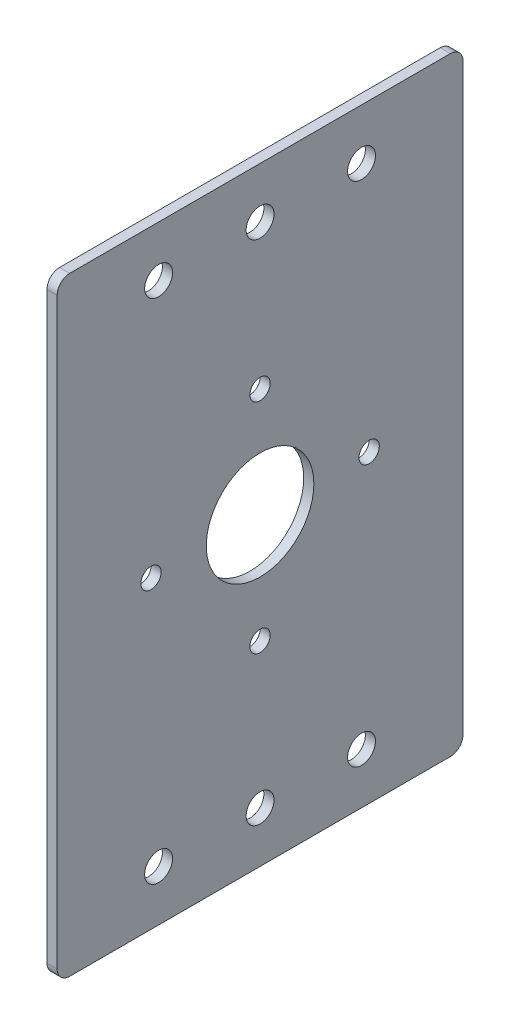
ISO-10303-21;
HEADER;
FILE_DESCRIPTION(('STEP AP214'),'2;1');
FILE_NAME('part.step','',(''),(''),'','','');
FILE_SCHEMA(('AUTOMOTIVE_DESIGN { 1 0 10303 214 1 1 1 1 }'));
ENDSEC;
DATA;
#1=APPLICATION_CONTEXT('core data for automotive mechanical design processes');
#2=APPLICATION_PROTOCOL_DEFINITION('international standard','automotive_design',2000,#1);
#3=PRODUCT_CONTEXT('',#1,'mechanical');
#4=PRODUCT('Part','Part','',(#3));
#5=PRODUCT_RELATED_PRODUCT_CATEGORY('part','',(#4));
#6=PRODUCT_DEFINITION_FORMATION('','',#4);
#7=PRODUCT_DEFINITION_CONTEXT('part definition',#1,'design');
#8=PRODUCT_DEFINITION('design','',#6,#7);
#9=PRODUCT_DEFINITION_SHAPE('','',#8);
#10=(LENGTH_UNIT() NAMED_UNIT(*) SI_UNIT(.MILLI.,.METRE.));
#11=(NAMED_UNIT(*) PLANE_ANGLE_UNIT() SI_UNIT($,.RADIAN.));
#12=(NAMED_UNIT(*) SI_UNIT($,.STERADIAN.) SOLID_ANGLE_UNIT());
#13=UNCERTAINTY_MEASURE_WITH_UNIT(LENGTH_MEASURE(1.E-05),#10,'distance_accuracy_value','');
#14=(GEOMETRIC_REPRESENTATION_CONTEXT(3) GLOBAL_UNCERTAINTY_ASSIGNED_CONTEXT((#13)) GLOBAL_UNIT_ASSIGNED_CONTEXT((#10,
#11,#12)) REPRESENTATION_CONTEXT('',''));
#15=CARTESIAN_POINT('',(0.,0.,0.));
#16=DIRECTION('',(0.,0.,1.));
#17=DIRECTION('',(1.,0.,0.));
#18=AXIS2_PLACEMENT_3D('',#15,#16,#17);
#19=CARTESIAN_POINT('',(2.54,0.,0.));
#20=DIRECTION('',(-1.,0.,0.));
#21=DIRECTION('',(0.,0.,1.));
#22=AXIS2_PLACEMENT_3D('',#19,#20,#21);
#23=PLANE('',#22);
#24=CARTESIAN_POINT('',(2.54,139.7,-25.4));
#25=DIRECTION('',(1.,0.,0.));
#26=DIRECTION('',(0.,0.,-1.));
#27=AXIS2_PLACEMENT_3D('',#24,#25,#26);
#28=CIRCLE('',#27,3.4925);
#29=CARTESIAN_POINT('',(2.54,139.7,-28.8925));
#30=VERTEX_POINT('',#29);
#31=EDGE_CURVE('E248',#30,#30,#28,.T.);
#32=ORIENTED_EDGE('',*,*,#31,.F.);
#33=EDGE_LOOP('',(#32));
#34=FACE_BOUND('',#33,.T.);
#35=CARTESIAN_POINT('',(2.54,12.7,-25.4));
#36=DIRECTION('',(1.,0.,0.));
#37=DIRECTION('',(0.,0.,-1.));
#38=AXIS2_PLACEMENT_3D('',#35,#36,#37);
#39=CIRCLE('',#38,3.49250000000001);
#40=CARTESIAN_POINT('',(2.54,12.7,-28.8925));
#41=VERTEX_POINT('',#40);
#42=EDGE_CURVE('E242',#41,#41,#39,.T.);
#43=ORIENTED_EDGE('',*,*,#42,.F.);
#44=EDGE_LOOP('',(#43));
#45=FACE_BOUND('',#44,.T.);
#46=CARTESIAN_POINT('',(2.54,139.7,-76.2));
#47=DIRECTION('',(1.,0.,0.));
#48=DIRECTION('',(0.,0.,-1.));
#49=AXIS2_PLACEMENT_3D('',#46,#47,#48);
#50=CIRCLE('',#49,3.4925);
#51=CARTESIAN_POINT('',(2.54,139.7,-79.6925));
#52=VERTEX_POINT('',#51);
#53=EDGE_CURVE('E237',#52,#52,#50,.T.);
#54=ORIENTED_EDGE('',*,*,#53,.F.);
#55=EDGE_LOOP('',(#54));
#56=FACE_BOUND('',#55,.T.);
#57=CARTESIAN_POINT('',(2.54,12.7,-76.2));
#58=DIRECTION('',(1.,0.,0.));
#59=DIRECTION('',(0.,0.,-1.));
#60=AXIS2_PLACEMENT_3D('',#57,#58,#59);
#61=CIRCLE('',#60,3.49250000000001);
#62=CARTESIAN_POINT('',(2.54,12.7,-79.6925));
#63=VERTEX_POINT('',#62);
#64=EDGE_CURVE('E230',#63,#63,#61,.T.);
#65=ORIENTED_EDGE('',*,*,#64,.F.);
#66=EDGE_LOOP('',(#65));
#67=FACE_BOUND('',#66,.T.);
#68=CARTESIAN_POINT('',(2.54,139.7,-50.8));
#69=DIRECTION('',(1.,0.,0.));
#70=DIRECTION('',(0.,0.,-1.));
#71=AXIS2_PLACEMENT_3D('',#68,#69,#70);
#72=CIRCLE('',#71,3.4925);
#73=CARTESIAN_POINT('',(2.54,139.7,-54.2925));
#74=VERTEX_POINT('',#73);
#75=EDGE_CURVE('E225',#74,#74,#72,.T.);
#76=ORIENTED_EDGE('',*,*,#75,.F.);
#77=EDGE_LOOP('',(#76));
#78=FACE_BOUND('',#77,.T.);
#79=CARTESIAN_POINT('',(2.54,12.7,-50.8));
#80=DIRECTION('',(1.,0.,0.));
#81=DIRECTION('',(0.,0.,-1.));
#82=AXIS2_PLACEMENT_3D('',#79,#80,#81);
#83=CIRCLE('',#82,3.49250000000001);
#84=CARTESIAN_POINT('',(2.54,12.7,-54.2925));
#85=VERTEX_POINT('',#84);
#86=EDGE_CURVE('E221',#85,#85,#83,.T.);
#87=ORIENTED_EDGE('',*,*,#86,.F.);
#88=EDGE_LOOP('',(#87));
#89=FACE_BOUND('',#88,.T.);
#90=DIRECTION('',(0.,0.,-1.));
#91=VECTOR('',#90,1.);
#92=CARTESIAN_POINT('',(2.54,0.,0.));
#93=LINE('',#92,#91);
#94=CARTESIAN_POINT('',(2.54,0.,-3.175));
#95=VERTEX_POINT('',#94);
#96=CARTESIAN_POINT('',(2.54,0.,-98.425));
#97=VERTEX_POINT('',#96);
#98=EDGE_CURVE('E177',#95,#97,#93,.T.);
#99=ORIENTED_EDGE('',*,*,#98,.T.);
#100=CARTESIAN_POINT('',(2.54,3.175,-98.425));
#101=DIRECTION('',(-1.,0.,0.));
#102=DIRECTION('',(0.,0.,1.));
#103=AXIS2_PLACEMENT_3D('',#100,#101,#102);
#104=CIRCLE('',#103,3.175);
#105=CARTESIAN_POINT('',(2.54,3.175,-101.6));
#106=VERTEX_POINT('',#105);
#107=EDGE_CURVE('E157',#97,#106,#104,.F.);
#108=ORIENTED_EDGE('',*,*,#107,.T.);
#109=DIRECTION('',(0.,1.,0.));
#110=VECTOR('',#109,1.);
#111=CARTESIAN_POINT('',(2.54,0.,-101.6));
#112=LINE('',#111,#110);
#113=CARTESIAN_POINT('',(2.54,149.225,-101.6));
#114=VERTEX_POINT('',#113);
#115=EDGE_CURVE('E127',#106,#114,#112,.T.);
#116=ORIENTED_EDGE('',*,*,#115,.T.);
#117=CARTESIAN_POINT('',(2.54,149.225,-98.425));
#118=DIRECTION('',(-1.,0.,0.));
#119=DIRECTION('',(0.,0.,1.));
#120=AXIS2_PLACEMENT_3D('',#117,#118,#119);
#121=CIRCLE('',#120,3.175);
#122=CARTESIAN_POINT('',(2.54,152.4,-98.425));
#123=VERTEX_POINT('',#122);
#124=EDGE_CURVE('E63',#114,#123,#121,.F.);
#125=ORIENTED_EDGE('',*,*,#124,.T.);
#126=DIRECTION('',(0.,0.,1.));
#127=VECTOR('',#126,1.);
#128=CARTESIAN_POINT('',(2.54,152.4,0.));
#129=LINE('',#128,#127);
#130=CARTESIAN_POINT('',(2.54,152.4,-3.175));
#131=VERTEX_POINT('',#130);
#132=EDGE_CURVE('E144',#123,#131,#129,.T.);
#133=ORIENTED_EDGE('',*,*,#132,.T.);
#134=CARTESIAN_POINT('',(2.54,149.225,-3.175));
#135=DIRECTION('',(-1.,0.,0.));
#136=DIRECTION('',(0.,0.,1.));
#137=AXIS2_PLACEMENT_3D('',#134,#135,#136);
#138=CIRCLE('',#137,3.175);
#139=CARTESIAN_POINT('',(2.54,149.225,0.));
#140=VERTEX_POINT('',#139);
#141=EDGE_CURVE('E152',#131,#140,#138,.F.);
#142=ORIENTED_EDGE('',*,*,#141,.T.);
#143=DIRECTION('',(0.,-1.,0.));
#144=VECTOR('',#143,1.);
#145=CARTESIAN_POINT('',(2.54,0.,0.));
#146=LINE('',#145,#144);
#147=CARTESIAN_POINT('',(2.54,3.175,0.));
#148=VERTEX_POINT('',#147);
#149=EDGE_CURVE('E138',#140,#148,#146,.T.);
#150=ORIENTED_EDGE('',*,*,#149,.T.);
#151=CARTESIAN_POINT('',(2.54,3.175,-3.175));
#152=DIRECTION('',(-1.,0.,0.));
#153=DIRECTION('',(0.,0.,1.));
#154=AXIS2_PLACEMENT_3D('',#151,#152,#153);
#155=CIRCLE('',#154,3.175);
#156=EDGE_CURVE('E155',#148,#95,#155,.F.);
#157=ORIENTED_EDGE('',*,*,#156,.T.);
#158=EDGE_LOOP('',(#99,#108,#116,#125,#133,#142,#150,#157));
#159=FACE_BOUND('',#158,.T.);
#160=CARTESIAN_POINT('',(2.54,76.2,-78.105));
#161=DIRECTION('',(1.,0.,0.));
#162=DIRECTION('',(0.,0.,-1.));
#163=AXIS2_PLACEMENT_3D('',#160,#161,#162);
#164=CIRCLE('',#163,2.53999999999995);
#165=CARTESIAN_POINT('',(2.54,76.2,-80.645));
#166=VERTEX_POINT('',#165);
#167=EDGE_CURVE('E183',#166,#166,#164,.T.);
#168=ORIENTED_EDGE('',*,*,#167,.F.);
#169=EDGE_LOOP('',(#168));
#170=FACE_BOUND('',#169,.T.);
#171=CARTESIAN_POINT('',(2.54,76.2,-50.8));
#172=DIRECTION('',(1.,0.,0.));
#173=DIRECTION('',(0.,0.,-1.));
#174=AXIS2_PLACEMENT_3D('',#171,#172,#173);
#175=CIRCLE('',#174,13.462);
#176=CARTESIAN_POINT('',(2.54,76.2,-64.262));
#177=VERTEX_POINT('',#176);
#178=EDGE_CURVE('E192',#177,#177,#175,.T.);
#179=ORIENTED_EDGE('',*,*,#178,.F.);
#180=EDGE_LOOP('',(#179));
#181=FACE_BOUND('',#180,.T.);
#182=CARTESIAN_POINT('',(2.54,48.895,-50.8));
#183=DIRECTION('',(1.,0.,0.));
#184=DIRECTION('',(0.,0.,-1.));
#185=AXIS2_PLACEMENT_3D('',#182,#183,#184);
#186=CIRCLE('',#185,2.54000000000003);
#187=CARTESIAN_POINT('',(2.54,48.895,-53.34));
#188=VERTEX_POINT('',#187);
#189=EDGE_CURVE('E197',#188,#188,#186,.T.);
#190=ORIENTED_EDGE('',*,*,#189,.F.);
#191=EDGE_LOOP('',(#190));
#192=FACE_BOUND('',#191,.T.);
#193=CARTESIAN_POINT('',(2.54,76.2,-23.495));
#194=DIRECTION('',(1.,0.,0.));
#195=DIRECTION('',(0.,0.,-1.));
#196=AXIS2_PLACEMENT_3D('',#193,#194,#195);
#197=CIRCLE('',#196,2.53999999999999);
#198=CARTESIAN_POINT('',(2.54,76.2,-26.035));
#199=VERTEX_POINT('',#198);
#200=EDGE_CURVE('E203',#199,#199,#197,.T.);
#201=ORIENTED_EDGE('',*,*,#200,.F.);
#202=EDGE_LOOP('',(#201));
#203=FACE_BOUND('',#202,.T.);
#204=CARTESIAN_POINT('',(2.54,103.505,-50.8));
#205=DIRECTION('',(1.,0.,0.));
#206=DIRECTION('',(0.,0.,-1.));
#207=AXIS2_PLACEMENT_3D('',#204,#205,#206);
#208=CIRCLE('',#207,2.54000000000002);
#209=CARTESIAN_POINT('',(2.54,103.505,-53.3400000000001));
#210=VERTEX_POINT('',#209);
#211=EDGE_CURVE('E209',#210,#210,#208,.T.);
#212=ORIENTED_EDGE('',*,*,#211,.F.);
#213=EDGE_LOOP('',(#212));
#214=FACE_BOUND('',#213,.T.);
#215=ADVANCED_FACE('F42',(#34,#45,#56,#67,#78,#89,#159,#170,#181,#192,#203,#214),#23,.F.);
#216=CARTESIAN_POINT('',(0.,0.,0.));
#217=DIRECTION('',(-1.,0.,0.));
#218=DIRECTION('',(0.,0.,1.));
#219=AXIS2_PLACEMENT_3D('',#216,#217,#218);
#220=PLANE('',#219);
#221=CARTESIAN_POINT('',(0.,139.7,-25.4));
#222=DIRECTION('',(1.,0.,0.));
#223=DIRECTION('',(0.,0.,-1.));
#224=AXIS2_PLACEMENT_3D('',#221,#222,#223);
#225=CIRCLE('',#224,3.4925);
#226=CARTESIAN_POINT('',(0.,139.7,-28.8925));
#227=VERTEX_POINT('',#226);
#228=EDGE_CURVE('E234',#227,#227,#225,.T.);
#229=ORIENTED_EDGE('',*,*,#228,.T.);
#230=EDGE_LOOP('',(#229));
#231=FACE_BOUND('',#230,.T.);
#232=CARTESIAN_POINT('',(0.,12.7,-25.4));
#233=DIRECTION('',(1.,0.,0.));
#234=DIRECTION('',(0.,0.,-1.));
#235=AXIS2_PLACEMENT_3D('',#232,#233,#234);
#236=CIRCLE('',#235,3.49250000000001);
#237=CARTESIAN_POINT('',(0.,12.7,-28.8925));
#238=VERTEX_POINT('',#237);
#239=EDGE_CURVE('E245',#238,#238,#236,.T.);
#240=ORIENTED_EDGE('',*,*,#239,.T.);
#241=EDGE_LOOP('',(#240));
#242=FACE_BOUND('',#241,.T.);
#243=CARTESIAN_POINT('',(0.,139.7,-76.2));
#244=DIRECTION('',(1.,0.,0.));
#245=DIRECTION('',(0.,0.,-1.));
#246=AXIS2_PLACEMENT_3D('',#243,#244,#245);
#247=CIRCLE('',#246,3.4925);
#248=CARTESIAN_POINT('',(0.,139.7,-79.6925));
#249=VERTEX_POINT('',#248);
#250=EDGE_CURVE('E222',#249,#249,#247,.T.);
#251=ORIENTED_EDGE('',*,*,#250,.T.);
#252=EDGE_LOOP('',(#251));
#253=FACE_BOUND('',#252,.T.);
#254=CARTESIAN_POINT('',(0.,12.7,-76.2));
#255=DIRECTION('',(1.,0.,0.));
#256=DIRECTION('',(0.,0.,-1.));
#257=AXIS2_PLACEMENT_3D('',#254,#255,#256);
#258=CIRCLE('',#257,3.49250000000001);
#259=CARTESIAN_POINT('',(0.,12.7,-79.6925));
#260=VERTEX_POINT('',#259);
#261=EDGE_CURVE('E233',#260,#260,#258,.T.);
#262=ORIENTED_EDGE('',*,*,#261,.T.);
#263=EDGE_LOOP('',(#262));
#264=FACE_BOUND('',#263,.T.);
#265=CARTESIAN_POINT('',(0.,139.7,-50.8));
#266=DIRECTION('',(1.,0.,0.));
#267=DIRECTION('',(0.,0.,-1.));
#268=AXIS2_PLACEMENT_3D('',#265,#266,#267);
#269=CIRCLE('',#268,3.4925);
#270=CARTESIAN_POINT('',(0.,139.7,-54.2925));
#271=VERTEX_POINT('',#270);
#272=EDGE_CURVE('E215',#271,#271,#269,.T.);
#273=ORIENTED_EDGE('',*,*,#272,.T.);
#274=EDGE_LOOP('',(#273));
#275=FACE_BOUND('',#274,.T.);
#276=CARTESIAN_POINT('',(0.,12.7,-50.8));
#277=DIRECTION('',(1.,0.,0.));
#278=DIRECTION('',(0.,0.,-1.));
#279=AXIS2_PLACEMENT_3D('',#276,#277,#278);
#280=CIRCLE('',#279,3.49250000000001);
#281=CARTESIAN_POINT('',(0.,12.7,-54.2925));
#282=VERTEX_POINT('',#281);
#283=EDGE_CURVE('E218',#282,#282,#280,.T.);
#284=ORIENTED_EDGE('',*,*,#283,.T.);
#285=EDGE_LOOP('',(#284));
#286=FACE_BOUND('',#285,.T.);
#287=CARTESIAN_POINT('',(0.,76.2,-23.495));
#288=DIRECTION('',(1.,0.,0.));
#289=DIRECTION('',(0.,0.,-1.));
#290=AXIS2_PLACEMENT_3D('',#287,#288,#289);
#291=CIRCLE('',#290,2.53999999999999);
#292=CARTESIAN_POINT('',(0.,76.2,-26.035));
#293=VERTEX_POINT('',#292);
#294=EDGE_CURVE('E206',#293,#293,#291,.T.);
#295=ORIENTED_EDGE('',*,*,#294,.T.);
#296=EDGE_LOOP('',(#295));
#297=FACE_BOUND('',#296,.T.);
#298=CARTESIAN_POINT('',(0.,76.2,-50.8));
#299=DIRECTION('',(1.,0.,0.));
#300=DIRECTION('',(0.,0.,-1.));
#301=AXIS2_PLACEMENT_3D('',#298,#299,#300);
#302=CIRCLE('',#301,13.462);
#303=CARTESIAN_POINT('',(0.,76.2,-64.262));
#304=VERTEX_POINT('',#303);
#305=EDGE_CURVE('E194',#304,#304,#302,.T.);
#306=ORIENTED_EDGE('',*,*,#305,.T.);
#307=EDGE_LOOP('',(#306));
#308=FACE_BOUND('',#307,.T.);
#309=DIRECTION('',(0.,1.,0.));
#310=VECTOR('',#309,1.);
#311=CARTESIAN_POINT('',(0.,0.,-101.6));
#312=LINE('',#311,#310);
#313=CARTESIAN_POINT('',(0.,3.175,-101.6));
#314=VERTEX_POINT('',#313);
#315=CARTESIAN_POINT('',(0.,149.225,-101.6));
#316=VERTEX_POINT('',#315);
#317=EDGE_CURVE('E125',#314,#316,#312,.T.);
#318=ORIENTED_EDGE('',*,*,#317,.F.);
#319=CARTESIAN_POINT('',(0.,3.175,-98.425));
#320=DIRECTION('',(-1.,0.,0.));
#321=DIRECTION('',(0.,0.,1.));
#322=AXIS2_PLACEMENT_3D('',#319,#320,#321);
#323=CIRCLE('',#322,3.175);
#324=CARTESIAN_POINT('',(0.,0.,-98.425));
#325=VERTEX_POINT('',#324);
#326=EDGE_CURVE('E108',#314,#325,#323,.T.);
#327=ORIENTED_EDGE('',*,*,#326,.T.);
#328=DIRECTION('',(0.,0.,-1.));
#329=VECTOR('',#328,1.);
#330=CARTESIAN_POINT('',(0.,0.,0.));
#331=LINE('',#330,#329);
#332=CARTESIAN_POINT('',(0.,0.,-3.175));
#333=VERTEX_POINT('',#332);
#334=EDGE_CURVE('E136',#333,#325,#331,.T.);
#335=ORIENTED_EDGE('',*,*,#334,.F.);
#336=CARTESIAN_POINT('',(0.,3.175,-3.175));
#337=DIRECTION('',(-1.,0.,0.));
#338=DIRECTION('',(0.,0.,1.));
#339=AXIS2_PLACEMENT_3D('',#336,#337,#338);
#340=CIRCLE('',#339,3.175);
#341=CARTESIAN_POINT('',(0.,3.175,0.));
#342=VERTEX_POINT('',#341);
#343=EDGE_CURVE('E119',#333,#342,#340,.T.);
#344=ORIENTED_EDGE('',*,*,#343,.T.);
#345=DIRECTION('',(0.,-1.,0.));
#346=VECTOR('',#345,1.);
#347=CARTESIAN_POINT('',(0.,0.,0.));
#348=LINE('',#347,#346);
#349=CARTESIAN_POINT('',(0.,149.225,0.));
#350=VERTEX_POINT('',#349);
#351=EDGE_CURVE('E140',#350,#342,#348,.T.);
#352=ORIENTED_EDGE('',*,*,#351,.F.);
#353=CARTESIAN_POINT('',(0.,149.225,-3.175));
#354=DIRECTION('',(-1.,0.,0.));
#355=DIRECTION('',(0.,0.,1.));
#356=AXIS2_PLACEMENT_3D('',#353,#354,#355);
#357=CIRCLE('',#356,3.175);
#358=CARTESIAN_POINT('',(0.,152.4,-3.175));
#359=VERTEX_POINT('',#358);
#360=EDGE_CURVE('E128',#350,#359,#357,.T.);
#361=ORIENTED_EDGE('',*,*,#360,.T.);
#362=DIRECTION('',(0.,0.,1.));
#363=VECTOR('',#362,1.);
#364=CARTESIAN_POINT('',(0.,152.4,0.));
#365=LINE('',#364,#363);
#366=CARTESIAN_POINT('',(0.,152.4,-98.425));
#367=VERTEX_POINT('',#366);
#368=EDGE_CURVE('E135',#367,#359,#365,.T.);
#369=ORIENTED_EDGE('',*,*,#368,.F.);
#370=CARTESIAN_POINT('',(0.,149.225,-98.425));
#371=DIRECTION('',(-1.,0.,0.));
#372=DIRECTION('',(0.,0.,1.));
#373=AXIS2_PLACEMENT_3D('',#370,#371,#372);
#374=CIRCLE('',#373,3.175);
#375=EDGE_CURVE('E134',#367,#316,#374,.T.);
#376=ORIENTED_EDGE('',*,*,#375,.T.);
#377=EDGE_LOOP('',(#318,#327,#335,#344,#352,#361,#369,#376));
#378=FACE_BOUND('',#377,.T.);
#379=CARTESIAN_POINT('',(0.,76.2,-78.105));
#380=DIRECTION('',(1.,0.,0.));
#381=DIRECTION('',(0.,0.,-1.));
#382=AXIS2_PLACEMENT_3D('',#379,#380,#381);
#383=CIRCLE('',#382,2.53999999999995);
#384=CARTESIAN_POINT('',(0.,76.2,-80.645));
#385=VERTEX_POINT('',#384);
#386=EDGE_CURVE('E185',#385,#385,#383,.T.);
#387=ORIENTED_EDGE('',*,*,#386,.T.);
#388=EDGE_LOOP('',(#387));
#389=FACE_BOUND('',#388,.T.);
#390=CARTESIAN_POINT('',(0.,48.895,-50.8));
#391=DIRECTION('',(1.,0.,0.));
#392=DIRECTION('',(0.,0.,-1.));
#393=AXIS2_PLACEMENT_3D('',#390,#391,#392);
#394=CIRCLE('',#393,2.54000000000003);
#395=CARTESIAN_POINT('',(0.,48.895,-53.34));
#396=VERTEX_POINT('',#395);
#397=EDGE_CURVE('E200',#396,#396,#394,.T.);
#398=ORIENTED_EDGE('',*,*,#397,.T.);
#399=EDGE_LOOP('',(#398));
#400=FACE_BOUND('',#399,.T.);
#401=CARTESIAN_POINT('',(0.,103.505,-50.8));
#402=DIRECTION('',(1.,0.,0.));
#403=DIRECTION('',(0.,0.,-1.));
#404=AXIS2_PLACEMENT_3D('',#401,#402,#403);
#405=CIRCLE('',#404,2.54000000000002);
#406=CARTESIAN_POINT('',(0.,103.505,-53.3400000000001));
#407=VERTEX_POINT('',#406);
#408=EDGE_CURVE('E212',#407,#407,#405,.T.);
#409=ORIENTED_EDGE('',*,*,#408,.T.);
#410=EDGE_LOOP('',(#409));
#411=FACE_BOUND('',#410,.T.);
#412=ADVANCED_FACE('F131',(#231,#242,#253,#264,#275,#286,#297,#308,#378,#389,#400,#411),#220,.T.);
#413=CARTESIAN_POINT('',(2.54,0.,0.));
#414=DIRECTION('',(0.,0.,-1.));
#415=DIRECTION('',(-1.,0.,0.));
#416=AXIS2_PLACEMENT_3D('',#413,#414,#415);
#417=PLANE('',#416);
#418=ORIENTED_EDGE('',*,*,#351,.T.);
#419=DIRECTION('',(-1.,0.,0.));
#420=VECTOR('',#419,1.);
#421=CARTESIAN_POINT('',(2.54,3.175,0.));
#422=LINE('',#421,#420);
#423=EDGE_CURVE('E162',#342,#148,#422,.F.);
#424=ORIENTED_EDGE('',*,*,#423,.T.);
#425=ORIENTED_EDGE('',*,*,#149,.F.);
#426=DIRECTION('',(-1.,0.,0.));
#427=VECTOR('',#426,1.);
#428=CARTESIAN_POINT('',(2.54,149.225,0.));
#429=LINE('',#428,#427);
#430=EDGE_CURVE('E159',#140,#350,#429,.T.);
#431=ORIENTED_EDGE('',*,*,#430,.T.);
#432=EDGE_LOOP('',(#418,#424,#425,#431));
#433=FACE_BOUND('',#432,.T.);
#434=ADVANCED_FACE('F168',(#433),#417,.F.);
#435=CARTESIAN_POINT('',(2.54,0.,0.));
#436=DIRECTION('',(0.,1.,0.));
#437=DIRECTION('',(0.,0.,1.));
#438=AXIS2_PLACEMENT_3D('',#435,#436,#437);
#439=PLANE('',#438);
#440=ORIENTED_EDGE('',*,*,#334,.T.);
#441=DIRECTION('',(-1.,0.,0.));
#442=VECTOR('',#441,1.);
#443=CARTESIAN_POINT('',(2.54,0.,-98.425));
#444=LINE('',#443,#442);
#445=EDGE_CURVE('E113',#325,#97,#444,.F.);
#446=ORIENTED_EDGE('',*,*,#445,.T.);
#447=ORIENTED_EDGE('',*,*,#98,.F.);
#448=DIRECTION('',(-1.,0.,0.));
#449=VECTOR('',#448,1.);
#450=CARTESIAN_POINT('',(2.54,0.,-3.175));
#451=LINE('',#450,#449);
#452=EDGE_CURVE('E118',#95,#333,#451,.T.);
#453=ORIENTED_EDGE('',*,*,#452,.T.);
#454=EDGE_LOOP('',(#440,#446,#447,#453));
#455=FACE_BOUND('',#454,.T.);
#456=ADVANCED_FACE('F182',(#455),#439,.F.);
#457=CARTESIAN_POINT('',(2.54,0.,-101.6));
#458=DIRECTION('',(0.,0.,1.));
#459=DIRECTION('',(1.,0.,0.));
#460=AXIS2_PLACEMENT_3D('',#457,#458,#459);
#461=PLANE('',#460);
#462=ORIENTED_EDGE('',*,*,#115,.F.);
#463=DIRECTION('',(-1.,0.,0.));
#464=VECTOR('',#463,1.);
#465=CARTESIAN_POINT('',(2.54,3.175,-101.6));
#466=LINE('',#465,#464);
#467=EDGE_CURVE('E112',#106,#314,#466,.T.);
#468=ORIENTED_EDGE('',*,*,#467,.T.);
#469=ORIENTED_EDGE('',*,*,#317,.T.);
#470=DIRECTION('',(-1.,0.,0.));
#471=VECTOR('',#470,1.);
#472=CARTESIAN_POINT('',(2.54,149.225,-101.6));
#473=LINE('',#472,#471);
#474=EDGE_CURVE('E129',#316,#114,#473,.F.);
#475=ORIENTED_EDGE('',*,*,#474,.T.);
#476=EDGE_LOOP('',(#462,#468,#469,#475));
#477=FACE_BOUND('',#476,.T.);
#478=ADVANCED_FACE('F124',(#477),#461,.F.);
#479=CARTESIAN_POINT('',(2.54,152.4,0.));
#480=DIRECTION('',(0.,-1.,0.));
#481=DIRECTION('',(0.,0.,-1.));
#482=AXIS2_PLACEMENT_3D('',#479,#480,#481);
#483=PLANE('',#482);
#484=ORIENTED_EDGE('',*,*,#132,.F.);
#485=DIRECTION('',(-1.,0.,0.));
#486=VECTOR('',#485,1.);
#487=CARTESIAN_POINT('',(2.54,152.4,-98.425));
#488=LINE('',#487,#486);
#489=EDGE_CURVE('E11',#123,#367,#488,.T.);
#490=ORIENTED_EDGE('',*,*,#489,.T.);
#491=ORIENTED_EDGE('',*,*,#368,.T.);
#492=DIRECTION('',(-1.,0.,0.));
#493=VECTOR('',#492,1.);
#494=CARTESIAN_POINT('',(2.54,152.4,-3.175));
#495=LINE('',#494,#493);
#496=EDGE_CURVE('E50',#359,#131,#495,.F.);
#497=ORIENTED_EDGE('',*,*,#496,.T.);
#498=EDGE_LOOP('',(#484,#490,#491,#497));
#499=FACE_BOUND('',#498,.T.);
#500=ADVANCED_FACE('F308',(#499),#483,.F.);
#501=CARTESIAN_POINT('',(2.54,76.2,-78.105));
#502=DIRECTION('',(-1.,0.,0.));
#503=DIRECTION('',(0.,0.,1.));
#504=AXIS2_PLACEMENT_3D('',#501,#502,#503);
#505=CYLINDRICAL_SURFACE('',#504,2.53999999999995);
#506=ORIENTED_EDGE('',*,*,#167,.T.);
#507=EDGE_LOOP('',(#506));
#508=FACE_BOUND('',#507,.T.);
#509=ORIENTED_EDGE('',*,*,#386,.F.);
#510=EDGE_LOOP('',(#509));
#511=FACE_BOUND('',#510,.T.);
#512=ADVANCED_FACE('F305',(#508,#511),#505,.F.);
#513=CARTESIAN_POINT('',(2.54,76.2,-50.8));
#514=DIRECTION('',(-1.,0.,0.));
#515=DIRECTION('',(0.,0.,1.));
#516=AXIS2_PLACEMENT_3D('',#513,#514,#515);
#517=CYLINDRICAL_SURFACE('',#516,13.462);
#518=ORIENTED_EDGE('',*,*,#178,.T.);
#519=EDGE_LOOP('',(#518));
#520=FACE_BOUND('',#519,.T.);
#521=ORIENTED_EDGE('',*,*,#305,.F.);
#522=EDGE_LOOP('',(#521));
#523=FACE_BOUND('',#522,.T.);
#524=ADVANCED_FACE('F301',(#520,#523),#517,.F.);
#525=CARTESIAN_POINT('',(2.54,48.895,-50.8));
#526=DIRECTION('',(-1.,0.,0.));
#527=DIRECTION('',(0.,0.,1.));
#528=AXIS2_PLACEMENT_3D('',#525,#526,#527);
#529=CYLINDRICAL_SURFACE('',#528,2.54000000000003);
#530=ORIENTED_EDGE('',*,*,#189,.T.);
#531=EDGE_LOOP('',(#530));
#532=FACE_BOUND('',#531,.T.);
#533=ORIENTED_EDGE('',*,*,#397,.F.);
#534=EDGE_LOOP('',(#533));
#535=FACE_BOUND('',#534,.T.);
#536=ADVANCED_FACE('F297',(#532,#535),#529,.F.);
#537=CARTESIAN_POINT('',(2.54,76.2,-23.495));
#538=DIRECTION('',(-1.,0.,0.));
#539=DIRECTION('',(0.,0.,1.));
#540=AXIS2_PLACEMENT_3D('',#537,#538,#539);
#541=CYLINDRICAL_SURFACE('',#540,2.53999999999999);
#542=ORIENTED_EDGE('',*,*,#200,.T.);
#543=EDGE_LOOP('',(#542));
#544=FACE_BOUND('',#543,.T.);
#545=ORIENTED_EDGE('',*,*,#294,.F.);
#546=EDGE_LOOP('',(#545));
#547=FACE_BOUND('',#546,.T.);
#548=ADVANCED_FACE('F289',(#544,#547),#541,.F.);
#549=CARTESIAN_POINT('',(2.54,103.505,-50.8));
#550=DIRECTION('',(-1.,0.,0.));
#551=DIRECTION('',(0.,0.,1.));
#552=AXIS2_PLACEMENT_3D('',#549,#550,#551);
#553=CYLINDRICAL_SURFACE('',#552,2.54000000000002);
#554=ORIENTED_EDGE('',*,*,#211,.T.);
#555=EDGE_LOOP('',(#554));
#556=FACE_BOUND('',#555,.T.);
#557=ORIENTED_EDGE('',*,*,#408,.F.);
#558=EDGE_LOOP('',(#557));
#559=FACE_BOUND('',#558,.T.);
#560=ADVANCED_FACE('F279',(#556,#559),#553,.F.);
#561=CARTESIAN_POINT('',(0.,12.7,-50.8));
#562=DIRECTION('',(1.,0.,0.));
#563=DIRECTION('',(0.,0.,-1.));
#564=AXIS2_PLACEMENT_3D('',#561,#562,#563);
#565=CYLINDRICAL_SURFACE('',#564,3.49250000000001);
#566=ORIENTED_EDGE('',*,*,#283,.F.);
#567=EDGE_LOOP('',(#566));
#568=FACE_BOUND('',#567,.T.);
#569=ORIENTED_EDGE('',*,*,#86,.T.);
#570=EDGE_LOOP('',(#569));
#571=FACE_BOUND('',#570,.T.);
#572=ADVANCED_FACE('F276',(#568,#571),#565,.F.);
#573=CARTESIAN_POINT('',(0.,139.7,-50.8));
#574=DIRECTION('',(1.,0.,0.));
#575=DIRECTION('',(0.,0.,-1.));
#576=AXIS2_PLACEMENT_3D('',#573,#574,#575);
#577=CYLINDRICAL_SURFACE('',#576,3.4925);
#578=ORIENTED_EDGE('',*,*,#272,.F.);
#579=EDGE_LOOP('',(#578));
#580=FACE_BOUND('',#579,.T.);
#581=ORIENTED_EDGE('',*,*,#75,.T.);
#582=EDGE_LOOP('',(#581));
#583=FACE_BOUND('',#582,.T.);
#584=ADVANCED_FACE('F278',(#580,#583),#577,.F.);
#585=CARTESIAN_POINT('',(0.,12.7,-76.2));
#586=DIRECTION('',(1.,0.,0.));
#587=DIRECTION('',(0.,0.,-1.));
#588=AXIS2_PLACEMENT_3D('',#585,#586,#587);
#589=CYLINDRICAL_SURFACE('',#588,3.49250000000001);
#590=ORIENTED_EDGE('',*,*,#261,.F.);
#591=EDGE_LOOP('',(#590));
#592=FACE_BOUND('',#591,.T.);
#593=ORIENTED_EDGE('',*,*,#64,.T.);
#594=EDGE_LOOP('',(#593));
#595=FACE_BOUND('',#594,.T.);
#596=ADVANCED_FACE('F286',(#592,#595),#589,.F.);
#597=CARTESIAN_POINT('',(0.,139.7,-76.2));
#598=DIRECTION('',(1.,0.,0.));
#599=DIRECTION('',(0.,0.,-1.));
#600=AXIS2_PLACEMENT_3D('',#597,#598,#599);
#601=CYLINDRICAL_SURFACE('',#600,3.4925);
#602=ORIENTED_EDGE('',*,*,#250,.F.);
#603=EDGE_LOOP('',(#602));
#604=FACE_BOUND('',#603,.T.);
#605=ORIENTED_EDGE('',*,*,#53,.T.);
#606=EDGE_LOOP('',(#605));
#607=FACE_BOUND('',#606,.T.);
#608=ADVANCED_FACE('F413',(#604,#607),#601,.F.);
#609=CARTESIAN_POINT('',(0.,12.7,-25.4));
#610=DIRECTION('',(1.,0.,0.));
#611=DIRECTION('',(0.,0.,-1.));
#612=AXIS2_PLACEMENT_3D('',#609,#610,#611);
#613=CYLINDRICAL_SURFACE('',#612,3.49250000000001);
#614=ORIENTED_EDGE('',*,*,#239,.F.);
#615=EDGE_LOOP('',(#614));
#616=FACE_BOUND('',#615,.T.);
#617=ORIENTED_EDGE('',*,*,#42,.T.);
#618=EDGE_LOOP('',(#617));
#619=FACE_BOUND('',#618,.T.);
#620=ADVANCED_FACE('F259',(#616,#619),#613,.F.);
#621=CARTESIAN_POINT('',(0.,139.7,-25.4));
#622=DIRECTION('',(1.,0.,0.));
#623=DIRECTION('',(0.,0.,-1.));
#624=AXIS2_PLACEMENT_3D('',#621,#622,#623);
#625=CYLINDRICAL_SURFACE('',#624,3.4925);
#626=ORIENTED_EDGE('',*,*,#228,.F.);
#627=EDGE_LOOP('',(#626));
#628=FACE_BOUND('',#627,.T.);
#629=ORIENTED_EDGE('',*,*,#31,.T.);
#630=EDGE_LOOP('',(#629));
#631=FACE_BOUND('',#630,.T.);
#632=ADVANCED_FACE('F256',(#628,#631),#625,.F.);
#633=CARTESIAN_POINT('',(2.54,3.175,-98.425));
#634=DIRECTION('',(-1.,0.,0.));
#635=DIRECTION('',(0.,0.,1.));
#636=AXIS2_PLACEMENT_3D('',#633,#634,#635);
#637=CYLINDRICAL_SURFACE('',#636,3.175);
#638=ORIENTED_EDGE('',*,*,#107,.F.);
#639=ORIENTED_EDGE('',*,*,#445,.F.);
#640=ORIENTED_EDGE('',*,*,#326,.F.);
#641=ORIENTED_EDGE('',*,*,#467,.F.);
#642=EDGE_LOOP('',(#638,#639,#640,#641));
#643=FACE_BOUND('',#642,.T.);
#644=ADVANCED_FACE('F111',(#643),#637,.T.);
#645=CARTESIAN_POINT('',(2.54,3.175,-3.175));
#646=DIRECTION('',(-1.,0.,0.));
#647=DIRECTION('',(0.,0.,1.));
#648=AXIS2_PLACEMENT_3D('',#645,#646,#647);
#649=CYLINDRICAL_SURFACE('',#648,3.175);
#650=ORIENTED_EDGE('',*,*,#156,.F.);
#651=ORIENTED_EDGE('',*,*,#423,.F.);
#652=ORIENTED_EDGE('',*,*,#343,.F.);
#653=ORIENTED_EDGE('',*,*,#452,.F.);
#654=EDGE_LOOP('',(#650,#651,#652,#653));
#655=FACE_BOUND('',#654,.T.);
#656=ADVANCED_FACE('F180',(#655),#649,.T.);
#657=CARTESIAN_POINT('',(2.54,149.225,-98.425));
#658=DIRECTION('',(-1.,0.,0.));
#659=DIRECTION('',(0.,0.,1.));
#660=AXIS2_PLACEMENT_3D('',#657,#658,#659);
#661=CYLINDRICAL_SURFACE('',#660,3.175);
#662=ORIENTED_EDGE('',*,*,#124,.F.);
#663=ORIENTED_EDGE('',*,*,#474,.F.);
#664=ORIENTED_EDGE('',*,*,#375,.F.);
#665=ORIENTED_EDGE('',*,*,#489,.F.);
#666=EDGE_LOOP('',(#662,#663,#664,#665));
#667=FACE_BOUND('',#666,.T.);
#668=ADVANCED_FACE('F324',(#667),#661,.T.);
#669=CARTESIAN_POINT('',(2.54,149.225,-3.175));
#670=DIRECTION('',(-1.,0.,0.));
#671=DIRECTION('',(0.,0.,1.));
#672=AXIS2_PLACEMENT_3D('',#669,#670,#671);
#673=CYLINDRICAL_SURFACE('',#672,3.175);
#674=ORIENTED_EDGE('',*,*,#141,.F.);
#675=ORIENTED_EDGE('',*,*,#496,.F.);
#676=ORIENTED_EDGE('',*,*,#360,.F.);
#677=ORIENTED_EDGE('',*,*,#430,.F.);
#678=EDGE_LOOP('',(#674,#675,#676,#677));
#679=FACE_BOUND('',#678,.T.);
#680=ADVANCED_FACE('F44',(#679),#673,.T.);
#681=CLOSED_SHELL('',(#215,#412,#434,#456,#478,#500,#512,#524,#536,#548,#560,#572,#584,#596,
#608,#620,#632,#644,#656,#668,#680));
#682=MANIFOLD_SOLID_BREP('B2',#681);
#683=ADVANCED_BREP_SHAPE_REPRESENTATION('',(#18,#682),#14);
#684=SHAPE_DEFINITION_REPRESENTATION(#9,#683);
ENDSEC;
END-ISO-10303-21;
